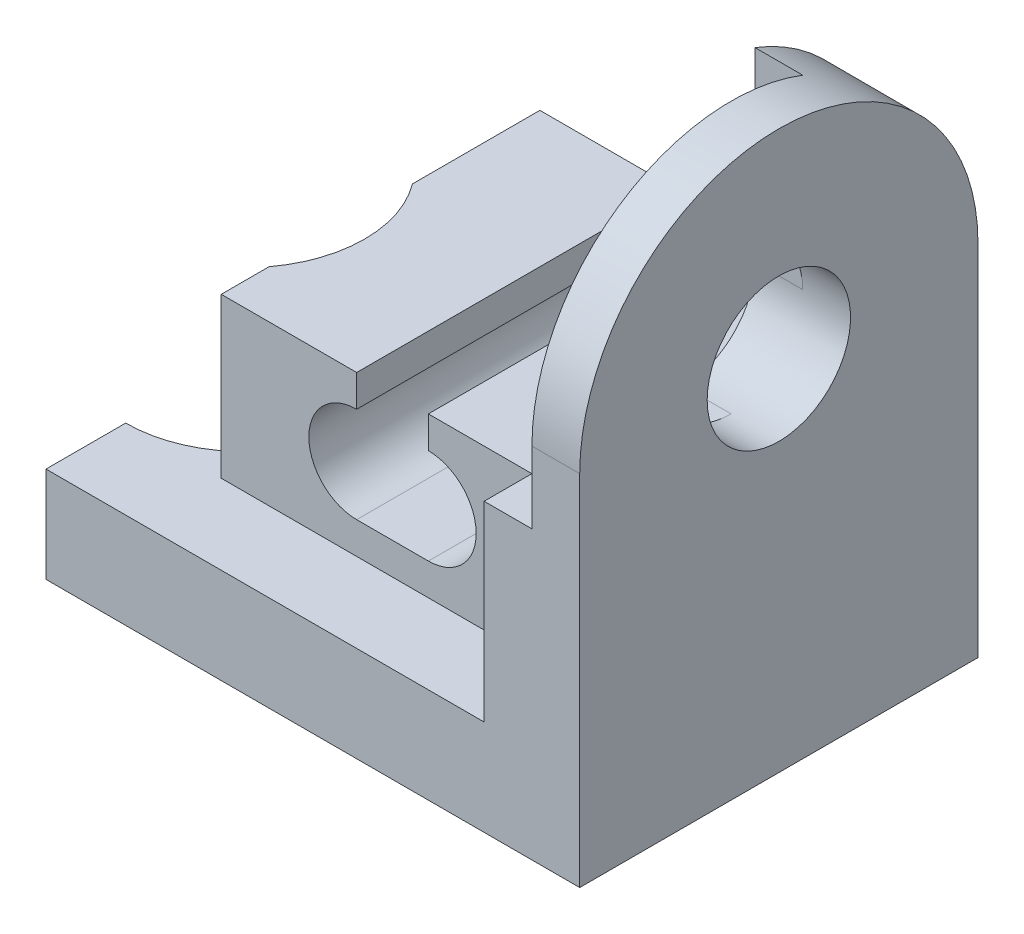
ISO-10303-21;
HEADER;
FILE_DESCRIPTION(('STEP AP214'),'2;1');
FILE_NAME('part.step','',(''),(''),'','','');
FILE_SCHEMA(('AUTOMOTIVE_DESIGN { 1 0 10303 214 1 1 1 1 }'));
ENDSEC;
DATA;
#1=APPLICATION_CONTEXT('core data for automotive mechanical design processes');
#2=APPLICATION_PROTOCOL_DEFINITION('international standard','automotive_design',2000,#1);
#3=PRODUCT_CONTEXT('',#1,'mechanical');
#4=PRODUCT('Part','Part','',(#3));
#5=PRODUCT_RELATED_PRODUCT_CATEGORY('part','',(#4));
#6=PRODUCT_DEFINITION_FORMATION('','',#4);
#7=PRODUCT_DEFINITION_CONTEXT('part definition',#1,'design');
#8=PRODUCT_DEFINITION('design','',#6,#7);
#9=PRODUCT_DEFINITION_SHAPE('','',#8);
#10=(LENGTH_UNIT() NAMED_UNIT(*) SI_UNIT(.MILLI.,.METRE.));
#11=(NAMED_UNIT(*) PLANE_ANGLE_UNIT() SI_UNIT($,.RADIAN.));
#12=(NAMED_UNIT(*) SI_UNIT($,.STERADIAN.) SOLID_ANGLE_UNIT());
#13=UNCERTAINTY_MEASURE_WITH_UNIT(LENGTH_MEASURE(1.E-05),#10,'distance_accuracy_value','');
#14=(GEOMETRIC_REPRESENTATION_CONTEXT(3) GLOBAL_UNCERTAINTY_ASSIGNED_CONTEXT((#13)) GLOBAL_UNIT_ASSIGNED_CONTEXT((#10,
#11,#12)) REPRESENTATION_CONTEXT('',''));
#15=CARTESIAN_POINT('',(0.,0.,0.));
#16=DIRECTION('',(0.,0.,1.));
#17=DIRECTION('',(1.,0.,0.));
#18=AXIS2_PLACEMENT_3D('',#15,#16,#17);
#19=CARTESIAN_POINT('',(-12.,0.,-25.));
#20=DIRECTION('',(1.,0.,0.));
#21=DIRECTION('',(0.,1.,0.));
#22=AXIS2_PLACEMENT_3D('',#19,#20,#21);
#23=PLANE('',#22);
#24=DIRECTION('',(0.,1.,0.));
#25=VECTOR('',#24,1.);
#26=CARTESIAN_POINT('',(-12.,0.,-9.));
#27=LINE('',#26,#25);
#28=CARTESIAN_POINT('',(-12.,45.,-9.));
#29=VERTEX_POINT('',#28);
#30=CARTESIAN_POINT('',(-12.,68.3238075793812,-9.));
#31=VERTEX_POINT('',#30);
#32=EDGE_CURVE('E224',#29,#31,#27,.T.);
#33=ORIENTED_EDGE('',*,*,#32,.T.);
#34=CARTESIAN_POINT('',(-12.,45.,0.));
#35=DIRECTION('',(-1.,0.,0.));
#36=DIRECTION('',(0.,0.,1.));
#37=AXIS2_PLACEMENT_3D('',#34,#35,#36);
#38=CIRCLE('',#37,25.);
#39=CARTESIAN_POINT('',(-12.,45.,-25.));
#40=VERTEX_POINT('',#39);
#41=EDGE_CURVE('E259',#31,#40,#38,.T.);
#42=ORIENTED_EDGE('',*,*,#41,.T.);
#43=DIRECTION('',(0.,1.,0.));
#44=VECTOR('',#43,1.);
#45=CARTESIAN_POINT('',(-12.,0.,-25.));
#46=LINE('',#45,#44);
#47=CARTESIAN_POINT('',(-12.,32.,-25.));
#48=VERTEX_POINT('',#47);
#49=EDGE_CURVE('E406',#48,#40,#46,.T.);
#50=ORIENTED_EDGE('',*,*,#49,.F.);
#51=DIRECTION('',(0.,0.,-1.));
#52=VECTOR('',#51,1.);
#53=CARTESIAN_POINT('',(-12.,32.,15.));
#54=LINE('',#53,#52);
#55=CARTESIAN_POINT('',(-12.,32.,15.));
#56=VERTEX_POINT('',#55);
#57=EDGE_CURVE('E366',#56,#48,#54,.T.);
#58=ORIENTED_EDGE('',*,*,#57,.F.);
#59=DIRECTION('',(0.,1.,0.));
#60=VECTOR('',#59,1.);
#61=CARTESIAN_POINT('',(-12.,0.,15.));
#62=LINE('',#61,#60);
#63=CARTESIAN_POINT('',(-12.,12.,15.));
#64=VERTEX_POINT('',#63);
#65=EDGE_CURVE('E336',#64,#56,#62,.T.);
#66=ORIENTED_EDGE('',*,*,#65,.F.);
#67=DIRECTION('',(0.,0.,1.));
#68=VECTOR('',#67,1.);
#69=CARTESIAN_POINT('',(-12.,12.,-25.));
#70=LINE('',#69,#68);
#71=CARTESIAN_POINT('',(-12.,12.,25.));
#72=VERTEX_POINT('',#71);
#73=EDGE_CURVE('E424',#64,#72,#70,.T.);
#74=ORIENTED_EDGE('',*,*,#73,.T.);
#75=DIRECTION('',(0.,1.,0.));
#76=VECTOR('',#75,1.);
#77=CARTESIAN_POINT('',(-12.,0.,25.));
#78=LINE('',#77,#76);
#79=CARTESIAN_POINT('',(-12.,36.,25.));
#80=VERTEX_POINT('',#79);
#81=EDGE_CURVE('E386',#72,#80,#78,.T.);
#82=ORIENTED_EDGE('',*,*,#81,.T.);
#83=DIRECTION('',(0.,0.,1.));
#84=VECTOR('',#83,1.);
#85=CARTESIAN_POINT('',(-12.,36.,0.));
#86=LINE('',#85,#84);
#87=CARTESIAN_POINT('',(-12.,36.,0.));
#88=VERTEX_POINT('',#87);
#89=EDGE_CURVE('E508',#88,#80,#86,.T.);
#90=ORIENTED_EDGE('',*,*,#89,.F.);
#91=CARTESIAN_POINT('',(-12.,45.,0.));
#92=DIRECTION('',(-1.,0.,0.));
#93=DIRECTION('',(0.,0.,1.));
#94=AXIS2_PLACEMENT_3D('',#91,#92,#93);
#95=CIRCLE('',#94,9.);
#96=EDGE_CURVE('E238',#29,#88,#95,.T.);
#97=ORIENTED_EDGE('',*,*,#96,.F.);
#98=EDGE_LOOP('',(#33,#42,#50,#58,#66,#74,#82,#90,#97));
#99=FACE_BOUND('',#98,.T.);
#100=ADVANCED_FACE('F59',(#99),#23,.F.);
#101=CARTESIAN_POINT('',(0.,45.,0.));
#102=DIRECTION('',(-1.,0.,0.));
#103=DIRECTION('',(0.,0.,1.));
#104=AXIS2_PLACEMENT_3D('',#101,#102,#103);
#105=CYLINDRICAL_SURFACE('',#104,25.);
#106=ORIENTED_EDGE('',*,*,#41,.F.);
#107=DIRECTION('',(-1.,0.,0.));
#108=VECTOR('',#107,1.);
#109=CARTESIAN_POINT('',(-6.00000000000001,68.3238075793812,-9.));
#110=LINE('',#109,#108);
#111=CARTESIAN_POINT('',(-6.00000000000001,68.3238075793812,-9.));
#112=VERTEX_POINT('',#111);
#113=EDGE_CURVE('E243',#112,#31,#110,.T.);
#114=ORIENTED_EDGE('',*,*,#113,.F.);
#115=CARTESIAN_POINT('',(-6.00000000000001,45.,0.));
#116=DIRECTION('',(-1.,0.,0.));
#117=DIRECTION('',(0.,0.,1.));
#118=AXIS2_PLACEMENT_3D('',#115,#116,#117);
#119=CIRCLE('',#118,25.);
#120=CARTESIAN_POINT('',(-6.00000000000001,45.,25.));
#121=VERTEX_POINT('',#120);
#122=EDGE_CURVE('E245',#121,#112,#119,.T.);
#123=ORIENTED_EDGE('',*,*,#122,.F.);
#124=DIRECTION('',(-1.,0.,0.));
#125=VECTOR('',#124,1.);
#126=CARTESIAN_POINT('',(0.,45.,25.));
#127=LINE('',#126,#125);
#128=CARTESIAN_POINT('',(0.,45.,25.));
#129=VERTEX_POINT('',#128);
#130=EDGE_CURVE('E253',#129,#121,#127,.T.);
#131=ORIENTED_EDGE('',*,*,#130,.F.);
#132=CARTESIAN_POINT('',(0.,45.,0.));
#133=DIRECTION('',(-1.,0.,0.));
#134=DIRECTION('',(0.,0.,1.));
#135=AXIS2_PLACEMENT_3D('',#132,#133,#134);
#136=CIRCLE('',#135,25.);
#137=CARTESIAN_POINT('',(0.,45.,-25.));
#138=VERTEX_POINT('',#137);
#139=EDGE_CURVE('E82',#129,#138,#136,.T.);
#140=ORIENTED_EDGE('',*,*,#139,.T.);
#141=DIRECTION('',(-1.,0.,0.));
#142=VECTOR('',#141,1.);
#143=CARTESIAN_POINT('',(0.,45.,-25.));
#144=LINE('',#143,#142);
#145=EDGE_CURVE('E262',#138,#40,#144,.T.);
#146=ORIENTED_EDGE('',*,*,#145,.T.);
#147=EDGE_LOOP('',(#106,#114,#123,#131,#140,#146));
#148=FACE_BOUND('',#147,.T.);
#149=ADVANCED_FACE('F517',(#148),#105,.T.);
#150=CARTESIAN_POINT('',(0.,45.,0.));
#151=DIRECTION('',(-1.,0.,0.));
#152=DIRECTION('',(0.,0.,1.));
#153=AXIS2_PLACEMENT_3D('',#150,#151,#152);
#154=CYLINDRICAL_SURFACE('',#153,9.);
#155=CARTESIAN_POINT('',(0.,45.,0.));
#156=DIRECTION('',(-1.,0.,0.));
#157=DIRECTION('',(0.,0.,1.));
#158=AXIS2_PLACEMENT_3D('',#155,#156,#157);
#159=CIRCLE('',#158,9.);
#160=CARTESIAN_POINT('',(0.,45.,9.));
#161=VERTEX_POINT('',#160);
#162=EDGE_CURVE('E249',#161,#161,#159,.T.);
#163=ORIENTED_EDGE('',*,*,#162,.F.);
#164=EDGE_LOOP('',(#163));
#165=FACE_BOUND('',#164,.T.);
#166=DIRECTION('',(-1.,0.,0.));
#167=VECTOR('',#166,1.);
#168=CARTESIAN_POINT('',(-6.00000000000001,45.,-9.));
#169=LINE('',#168,#167);
#170=CARTESIAN_POINT('',(-6.00000000000001,45.,-9.));
#171=VERTEX_POINT('',#170);
#172=EDGE_CURVE('E74',#171,#29,#169,.T.);
#173=ORIENTED_EDGE('',*,*,#172,.T.);
#174=ORIENTED_EDGE('',*,*,#96,.T.);
#175=DIRECTION('',(-1.,0.,0.));
#176=VECTOR('',#175,1.);
#177=CARTESIAN_POINT('',(-6.00000000000001,36.,0.));
#178=LINE('',#177,#176);
#179=CARTESIAN_POINT('',(-6.00000000000001,36.,0.));
#180=VERTEX_POINT('',#179);
#181=EDGE_CURVE('E228',#180,#88,#178,.T.);
#182=ORIENTED_EDGE('',*,*,#181,.F.);
#183=CARTESIAN_POINT('',(-6.00000000000001,45.,0.));
#184=DIRECTION('',(-1.,0.,0.));
#185=DIRECTION('',(0.,0.,1.));
#186=AXIS2_PLACEMENT_3D('',#183,#184,#185);
#187=CIRCLE('',#186,9.);
#188=EDGE_CURVE('E214',#180,#171,#187,.T.);
#189=ORIENTED_EDGE('',*,*,#188,.T.);
#190=EDGE_LOOP('',(#173,#174,#182,#189));
#191=FACE_BOUND('',#190,.T.);
#192=ADVANCED_FACE('F236',(#165,#191),#154,.F.);
#193=CARTESIAN_POINT('',(0.,0.,-25.));
#194=DIRECTION('',(1.,0.,0.));
#195=DIRECTION('',(0.,0.,-1.));
#196=AXIS2_PLACEMENT_3D('',#193,#194,#195);
#197=PLANE('',#196);
#198=ORIENTED_EDGE('',*,*,#162,.T.);
#199=EDGE_LOOP('',(#198));
#200=FACE_BOUND('',#199,.T.);
#201=ORIENTED_EDGE('',*,*,#139,.F.);
#202=DIRECTION('',(0.,1.,0.));
#203=VECTOR('',#202,1.);
#204=CARTESIAN_POINT('',(0.,0.,25.));
#205=LINE('',#204,#203);
#206=CARTESIAN_POINT('',(0.,0.,25.));
#207=VERTEX_POINT('',#206);
#208=EDGE_CURVE('E402',#207,#129,#205,.T.);
#209=ORIENTED_EDGE('',*,*,#208,.F.);
#210=DIRECTION('',(0.,0.,1.));
#211=VECTOR('',#210,1.);
#212=CARTESIAN_POINT('',(0.,0.,-25.));
#213=LINE('',#212,#211);
#214=CARTESIAN_POINT('',(0.,0.,-25.));
#215=VERTEX_POINT('',#214);
#216=EDGE_CURVE('E425',#215,#207,#213,.T.);
#217=ORIENTED_EDGE('',*,*,#216,.F.);
#218=DIRECTION('',(0.,1.,0.));
#219=VECTOR('',#218,1.);
#220=CARTESIAN_POINT('',(0.,0.,-25.));
#221=LINE('',#220,#219);
#222=EDGE_CURVE('E420',#215,#138,#221,.T.);
#223=ORIENTED_EDGE('',*,*,#222,.T.);
#224=EDGE_LOOP('',(#201,#209,#217,#223));
#225=FACE_BOUND('',#224,.T.);
#226=ADVANCED_FACE('F523',(#200,#225),#197,.T.);
#227=CARTESIAN_POINT('',(0.,0.,25.));
#228=DIRECTION('',(0.,0.,1.));
#229=DIRECTION('',(1.,0.,0.));
#230=AXIS2_PLACEMENT_3D('',#227,#228,#229);
#231=PLANE('',#230);
#232=DIRECTION('',(-1.,0.,0.));
#233=VECTOR('',#232,1.);
#234=CARTESIAN_POINT('',(-6.00000000000001,36.,25.));
#235=LINE('',#234,#233);
#236=CARTESIAN_POINT('',(-6.00000000000001,36.,25.));
#237=VERTEX_POINT('',#236);
#238=EDGE_CURVE('E231',#237,#80,#235,.T.);
#239=ORIENTED_EDGE('',*,*,#238,.T.);
#240=ORIENTED_EDGE('',*,*,#81,.F.);
#241=DIRECTION('',(-1.,0.,0.));
#242=VECTOR('',#241,1.);
#243=CARTESIAN_POINT('',(0.,12.,25.));
#244=LINE('',#243,#242);
#245=CARTESIAN_POINT('',(-67.,12.,25.));
#246=VERTEX_POINT('',#245);
#247=EDGE_CURVE('E390',#72,#246,#244,.T.);
#248=ORIENTED_EDGE('',*,*,#247,.T.);
#249=DIRECTION('',(0.,1.,0.));
#250=VECTOR('',#249,1.);
#251=CARTESIAN_POINT('',(-67.,0.,25.));
#252=LINE('',#251,#250);
#253=CARTESIAN_POINT('',(-67.,0.,25.));
#254=VERTEX_POINT('',#253);
#255=EDGE_CURVE('E394',#254,#246,#252,.T.);
#256=ORIENTED_EDGE('',*,*,#255,.F.);
#257=DIRECTION('',(-1.,0.,0.));
#258=VECTOR('',#257,1.);
#259=CARTESIAN_POINT('',(0.,0.,25.));
#260=LINE('',#259,#258);
#261=EDGE_CURVE('E398',#207,#254,#260,.T.);
#262=ORIENTED_EDGE('',*,*,#261,.F.);
#263=ORIENTED_EDGE('',*,*,#208,.T.);
#264=ORIENTED_EDGE('',*,*,#130,.T.);
#265=DIRECTION('',(0.,1.,0.));
#266=VECTOR('',#265,1.);
#267=CARTESIAN_POINT('',(-6.00000000000001,0.,25.));
#268=LINE('',#267,#266);
#269=EDGE_CURVE('E233',#237,#121,#268,.T.);
#270=ORIENTED_EDGE('',*,*,#269,.F.);
#271=EDGE_LOOP('',(#239,#240,#248,#256,#262,#263,#264,#270));
#272=FACE_BOUND('',#271,.T.);
#273=ADVANCED_FACE('F518',(#272),#231,.T.);
#274=CARTESIAN_POINT('',(0.,0.,-25.));
#275=DIRECTION('',(0.,0.,1.));
#276=DIRECTION('',(1.,0.,0.));
#277=AXIS2_PLACEMENT_3D('',#274,#275,#276);
#278=PLANE('',#277);
#279=ORIENTED_EDGE('',*,*,#145,.F.);
#280=ORIENTED_EDGE('',*,*,#222,.F.);
#281=DIRECTION('',(-1.,0.,0.));
#282=VECTOR('',#281,1.);
#283=CARTESIAN_POINT('',(0.,0.,-25.));
#284=LINE('',#283,#282);
#285=CARTESIAN_POINT('',(-67.,0.,-25.));
#286=VERTEX_POINT('',#285);
#287=EDGE_CURVE('E417',#215,#286,#284,.T.);
#288=ORIENTED_EDGE('',*,*,#287,.T.);
#289=DIRECTION('',(0.,1.,0.));
#290=VECTOR('',#289,1.);
#291=CARTESIAN_POINT('',(-67.,0.,-25.));
#292=LINE('',#291,#290);
#293=CARTESIAN_POINT('',(-67.,12.,-25.));
#294=VERTEX_POINT('',#293);
#295=EDGE_CURVE('E413',#286,#294,#292,.T.);
#296=ORIENTED_EDGE('',*,*,#295,.T.);
#297=DIRECTION('',(-1.,0.,0.));
#298=VECTOR('',#297,1.);
#299=CARTESIAN_POINT('',(0.,12.,-25.));
#300=LINE('',#299,#298);
#301=CARTESIAN_POINT('',(-55.,12.,-25.));
#302=VERTEX_POINT('',#301);
#303=EDGE_CURVE('E410',#302,#294,#300,.T.);
#304=ORIENTED_EDGE('',*,*,#303,.F.);
#305=DIRECTION('',(0.,1.,0.));
#306=VECTOR('',#305,1.);
#307=CARTESIAN_POINT('',(-55.,0.,-25.));
#308=LINE('',#307,#306);
#309=CARTESIAN_POINT('',(-55.,32.,-25.));
#310=VERTEX_POINT('',#309);
#311=EDGE_CURVE('E298',#302,#310,#308,.T.);
#312=ORIENTED_EDGE('',*,*,#311,.T.);
#313=DIRECTION('',(-1.,0.,0.));
#314=VECTOR('',#313,1.);
#315=CARTESIAN_POINT('',(0.,32.,-25.));
#316=LINE('',#315,#314);
#317=CARTESIAN_POINT('',(-38.,32.,-25.));
#318=VERTEX_POINT('',#317);
#319=EDGE_CURVE('E294',#318,#310,#316,.T.);
#320=ORIENTED_EDGE('',*,*,#319,.F.);
#321=DIRECTION('',(0.,1.,0.));
#322=VECTOR('',#321,1.);
#323=CARTESIAN_POINT('',(-38.,0.,-25.));
#324=LINE('',#323,#322);
#325=CARTESIAN_POINT('',(-38.,28.0000000262302,-25.));
#326=VERTEX_POINT('',#325);
#327=EDGE_CURVE('E290',#326,#318,#324,.T.);
#328=ORIENTED_EDGE('',*,*,#327,.F.);
#329=CARTESIAN_POINT('',(-38.,22.,-25.));
#330=DIRECTION('',(0.,0.,1.));
#331=DIRECTION('',(1.,0.,0.));
#332=AXIS2_PLACEMENT_3D('',#329,#330,#331);
#333=CIRCLE('',#332,6.00000002623018);
#334=CARTESIAN_POINT('',(-37.9992065743153,16.0000000262302,-25.));
#335=VERTEX_POINT('',#334);
#336=EDGE_CURVE('E286',#326,#335,#333,.T.);
#337=ORIENTED_EDGE('',*,*,#336,.T.);
#338=DIRECTION('',(1.,0.,0.));
#339=VECTOR('',#338,1.);
#340=CARTESIAN_POINT('',(0.,16.0000000262302,-25.));
#341=LINE('',#340,#339);
#342=CARTESIAN_POINT('',(-29.,16.0000000262302,-25.));
#343=VERTEX_POINT('',#342);
#344=EDGE_CURVE('E314',#335,#343,#341,.T.);
#345=ORIENTED_EDGE('',*,*,#344,.T.);
#346=CARTESIAN_POINT('',(-29.,22.0000000262302,-25.));
#347=DIRECTION('',(0.,0.,1.));
#348=DIRECTION('',(1.,0.,0.));
#349=AXIS2_PLACEMENT_3D('',#346,#347,#348);
#350=CIRCLE('',#349,6.);
#351=CARTESIAN_POINT('',(-29.,28.0000000262302,-25.));
#352=VERTEX_POINT('',#351);
#353=EDGE_CURVE('E310',#343,#352,#350,.T.);
#354=ORIENTED_EDGE('',*,*,#353,.T.);
#355=DIRECTION('',(0.,1.,0.));
#356=VECTOR('',#355,1.);
#357=CARTESIAN_POINT('',(-29.,0.,-25.));
#358=LINE('',#357,#356);
#359=CARTESIAN_POINT('',(-29.,32.,-25.));
#360=VERTEX_POINT('',#359);
#361=EDGE_CURVE('E306',#352,#360,#358,.T.);
#362=ORIENTED_EDGE('',*,*,#361,.T.);
#363=DIRECTION('',(-1.,0.,0.));
#364=VECTOR('',#363,1.);
#365=CARTESIAN_POINT('',(0.,32.,-25.));
#366=LINE('',#365,#364);
#367=EDGE_CURVE('E302',#48,#360,#366,.T.);
#368=ORIENTED_EDGE('',*,*,#367,.F.);
#369=ORIENTED_EDGE('',*,*,#49,.T.);
#370=EDGE_LOOP('',(#279,#280,#288,#296,#304,#312,#320,#328,#337,#345,#354,#362,#368,#369));
#371=FACE_BOUND('',#370,.T.);
#372=ADVANCED_FACE('F483',(#371),#278,.F.);
#373=CARTESIAN_POINT('',(-67.,0.,-25.));
#374=DIRECTION('',(1.,0.,0.));
#375=DIRECTION('',(0.,0.,-1.));
#376=AXIS2_PLACEMENT_3D('',#373,#374,#375);
#377=PLANE('',#376);
#378=DIRECTION('',(0.,0.,1.));
#379=VECTOR('',#378,1.);
#380=CARTESIAN_POINT('',(-67.,12.,-25.));
#381=LINE('',#380,#379);
#382=CARTESIAN_POINT('',(-67.,12.,15.));
#383=VERTEX_POINT('',#382);
#384=EDGE_CURVE('E437',#383,#246,#381,.T.);
#385=ORIENTED_EDGE('',*,*,#384,.F.);
#386=DIRECTION('',(0.,-1.,0.));
#387=VECTOR('',#386,1.);
#388=CARTESIAN_POINT('',(-67.,70.,15.));
#389=LINE('',#388,#387);
#390=CARTESIAN_POINT('',(-67.,0.,15.));
#391=VERTEX_POINT('',#390);
#392=EDGE_CURVE('E277',#383,#391,#389,.T.);
#393=ORIENTED_EDGE('',*,*,#392,.T.);
#394=DIRECTION('',(0.,0.,1.));
#395=VECTOR('',#394,1.);
#396=CARTESIAN_POINT('',(-67.,0.,-25.));
#397=LINE('',#396,#395);
#398=EDGE_CURVE('E432',#391,#254,#397,.T.);
#399=ORIENTED_EDGE('',*,*,#398,.T.);
#400=ORIENTED_EDGE('',*,*,#255,.T.);
#401=EDGE_LOOP('',(#385,#393,#399,#400));
#402=FACE_BOUND('',#401,.T.);
#403=ADVANCED_FACE('F572',(#402),#377,.F.);
#404=CARTESIAN_POINT('',(0.,12.,-25.));
#405=DIRECTION('',(0.,1.,0.));
#406=DIRECTION('',(-1.,0.,0.));
#407=AXIS2_PLACEMENT_3D('',#404,#405,#406);
#408=PLANE('',#407);
#409=CARTESIAN_POINT('',(-67.,12.,0.));
#410=DIRECTION('',(0.,1.,0.));
#411=DIRECTION('',(-1.,0.,0.));
#412=AXIS2_PLACEMENT_3D('',#409,#410,#411);
#413=CIRCLE('',#412,15.);
#414=CARTESIAN_POINT('',(-55.,12.,8.99999999999995));
#415=VERTEX_POINT('',#414);
#416=EDGE_CURVE('E274',#383,#415,#413,.T.);
#417=ORIENTED_EDGE('',*,*,#416,.F.);
#418=ORIENTED_EDGE('',*,*,#384,.T.);
#419=ORIENTED_EDGE('',*,*,#247,.F.);
#420=ORIENTED_EDGE('',*,*,#73,.F.);
#421=DIRECTION('',(-1.,0.,0.));
#422=VECTOR('',#421,1.);
#423=CARTESIAN_POINT('',(0.,12.,15.));
#424=LINE('',#423,#422);
#425=CARTESIAN_POINT('',(-55.,12.,15.));
#426=VERTEX_POINT('',#425);
#427=EDGE_CURVE('E332',#64,#426,#424,.T.);
#428=ORIENTED_EDGE('',*,*,#427,.T.);
#429=DIRECTION('',(0.,0.,-1.));
#430=VECTOR('',#429,1.);
#431=CARTESIAN_POINT('',(-55.,12.,15.));
#432=LINE('',#431,#430);
#433=EDGE_CURVE('E371',#426,#415,#432,.T.);
#434=ORIENTED_EDGE('',*,*,#433,.T.);
#435=EDGE_LOOP('',(#417,#418,#419,#420,#428,#434));
#436=FACE_BOUND('',#435,.T.);
#437=ADVANCED_FACE('F459',(#436),#408,.T.);
#438=CARTESIAN_POINT('',(-55.,0.,15.));
#439=DIRECTION('',(-1.,0.,0.));
#440=DIRECTION('',(0.,-1.,0.));
#441=AXIS2_PLACEMENT_3D('',#438,#439,#440);
#442=PLANE('',#441);
#443=DIRECTION('',(0.,-1.,0.));
#444=VECTOR('',#443,1.);
#445=CARTESIAN_POINT('',(-55.,70.,-8.99999999999995));
#446=LINE('',#445,#444);
#447=CARTESIAN_POINT('',(-55.,32.,-8.99999999999996));
#448=VERTEX_POINT('',#447);
#449=CARTESIAN_POINT('',(-55.,12.,-8.99999999999995));
#450=VERTEX_POINT('',#449);
#451=EDGE_CURVE('E13',#448,#450,#446,.T.);
#452=ORIENTED_EDGE('',*,*,#451,.F.);
#453=DIRECTION('',(0.,0.,-1.));
#454=VECTOR('',#453,1.);
#455=CARTESIAN_POINT('',(-55.,32.,15.));
#456=LINE('',#455,#454);
#457=EDGE_CURVE('E375',#448,#310,#456,.T.);
#458=ORIENTED_EDGE('',*,*,#457,.T.);
#459=ORIENTED_EDGE('',*,*,#311,.F.);
#460=EDGE_CURVE('E370',#450,#302,#432,.T.);
#461=ORIENTED_EDGE('',*,*,#460,.F.);
#462=EDGE_LOOP('',(#452,#458,#459,#461));
#463=FACE_BOUND('',#462,.T.);
#464=ADVANCED_FACE('F497',(#463),#442,.T.);
#465=CARTESIAN_POINT('',(0.,0.,-25.));
#466=DIRECTION('',(0.,1.,0.));
#467=DIRECTION('',(-1.,0.,0.));
#468=AXIS2_PLACEMENT_3D('',#465,#466,#467);
#469=PLANE('',#468);
#470=ORIENTED_EDGE('',*,*,#398,.F.);
#471=CARTESIAN_POINT('',(-67.,0.,0.));
#472=DIRECTION('',(0.,-1.,0.));
#473=DIRECTION('',(1.,0.,0.));
#474=AXIS2_PLACEMENT_3D('',#471,#472,#473);
#475=CIRCLE('',#474,15.);
#476=CARTESIAN_POINT('',(-67.,0.,-15.));
#477=VERTEX_POINT('',#476);
#478=EDGE_CURVE('E267',#477,#391,#475,.T.);
#479=ORIENTED_EDGE('',*,*,#478,.F.);
#480=EDGE_CURVE('E428',#286,#477,#397,.T.);
#481=ORIENTED_EDGE('',*,*,#480,.F.);
#482=ORIENTED_EDGE('',*,*,#287,.F.);
#483=ORIENTED_EDGE('',*,*,#216,.T.);
#484=ORIENTED_EDGE('',*,*,#261,.T.);
#485=EDGE_LOOP('',(#470,#479,#481,#482,#483,#484));
#486=FACE_BOUND('',#485,.T.);
#487=ADVANCED_FACE('F575',(#486),#469,.F.);
#488=ORIENTED_EDGE('',*,*,#480,.T.);
#489=DIRECTION('',(0.,-1.,0.));
#490=VECTOR('',#489,1.);
#491=CARTESIAN_POINT('',(-67.,70.,-15.));
#492=LINE('',#491,#490);
#493=CARTESIAN_POINT('',(-67.,12.,-15.));
#494=VERTEX_POINT('',#493);
#495=EDGE_CURVE('E282',#477,#494,#492,.F.);
#496=ORIENTED_EDGE('',*,*,#495,.T.);
#497=EDGE_CURVE('E433',#294,#494,#381,.T.);
#498=ORIENTED_EDGE('',*,*,#497,.F.);
#499=ORIENTED_EDGE('',*,*,#295,.F.);
#500=EDGE_LOOP('',(#488,#496,#498,#499));
#501=FACE_BOUND('',#500,.T.);
#502=ADVANCED_FACE('F578',(#501),#377,.F.);
#503=EDGE_CURVE('E278',#450,#494,#413,.T.);
#504=ORIENTED_EDGE('',*,*,#503,.F.);
#505=ORIENTED_EDGE('',*,*,#460,.T.);
#506=ORIENTED_EDGE('',*,*,#303,.T.);
#507=ORIENTED_EDGE('',*,*,#497,.T.);
#508=EDGE_LOOP('',(#504,#505,#506,#507));
#509=FACE_BOUND('',#508,.T.);
#510=ADVANCED_FACE('F568',(#509),#408,.T.);
#511=CARTESIAN_POINT('',(-38.,22.,15.));
#512=DIRECTION('',(0.,0.,-1.));
#513=DIRECTION('',(-1.,0.,0.));
#514=AXIS2_PLACEMENT_3D('',#511,#512,#513);
#515=CYLINDRICAL_SURFACE('',#514,6.00000002623018);
#516=DIRECTION('',(0.,0.,-1.));
#517=VECTOR('',#516,1.);
#518=CARTESIAN_POINT('',(-37.9992065743153,16.0000000262302,15.));
#519=LINE('',#518,#517);
#520=CARTESIAN_POINT('',(-37.9992065743153,16.0000000262302,15.));
#521=VERTEX_POINT('',#520);
#522=EDGE_CURVE('E354',#521,#335,#519,.T.);
#523=ORIENTED_EDGE('',*,*,#522,.T.);
#524=ORIENTED_EDGE('',*,*,#336,.F.);
#525=DIRECTION('',(0.,0.,-1.));
#526=VECTOR('',#525,1.);
#527=CARTESIAN_POINT('',(-38.,28.0000000262302,15.));
#528=LINE('',#527,#526);
#529=CARTESIAN_POINT('',(-38.,28.0000000262302,15.));
#530=VERTEX_POINT('',#529);
#531=EDGE_CURVE('E383',#530,#326,#528,.T.);
#532=ORIENTED_EDGE('',*,*,#531,.F.);
#533=CARTESIAN_POINT('',(-38.,22.,15.));
#534=DIRECTION('',(0.,0.,1.));
#535=DIRECTION('',(1.,0.,0.));
#536=AXIS2_PLACEMENT_3D('',#533,#534,#535);
#537=CIRCLE('',#536,6.00000002623018);
#538=EDGE_CURVE('E318',#530,#521,#537,.T.);
#539=ORIENTED_EDGE('',*,*,#538,.T.);
#540=EDGE_LOOP('',(#523,#524,#532,#539));
#541=FACE_BOUND('',#540,.T.);
#542=ADVANCED_FACE('F488',(#541),#515,.F.);
#543=CARTESIAN_POINT('',(-38.,0.,15.));
#544=DIRECTION('',(-1.,0.,0.));
#545=DIRECTION('',(0.,0.,1.));
#546=AXIS2_PLACEMENT_3D('',#543,#544,#545);
#547=PLANE('',#546);
#548=ORIENTED_EDGE('',*,*,#531,.T.);
#549=ORIENTED_EDGE('',*,*,#327,.T.);
#550=DIRECTION('',(0.,0.,-1.));
#551=VECTOR('',#550,1.);
#552=CARTESIAN_POINT('',(-38.,32.,15.));
#553=LINE('',#552,#551);
#554=CARTESIAN_POINT('',(-38.,32.,15.));
#555=VERTEX_POINT('',#554);
#556=EDGE_CURVE('E380',#555,#318,#553,.T.);
#557=ORIENTED_EDGE('',*,*,#556,.F.);
#558=DIRECTION('',(0.,1.,0.));
#559=VECTOR('',#558,1.);
#560=CARTESIAN_POINT('',(-38.,0.,15.));
#561=LINE('',#560,#559);
#562=EDGE_CURVE('E322',#530,#555,#561,.T.);
#563=ORIENTED_EDGE('',*,*,#562,.F.);
#564=EDGE_LOOP('',(#548,#549,#557,#563));
#565=FACE_BOUND('',#564,.T.);
#566=ADVANCED_FACE('F492',(#565),#547,.F.);
#567=CARTESIAN_POINT('',(0.,32.,15.));
#568=DIRECTION('',(0.,-1.,0.));
#569=DIRECTION('',(1.,0.,0.));
#570=AXIS2_PLACEMENT_3D('',#567,#568,#569);
#571=PLANE('',#570);
#572=ORIENTED_EDGE('',*,*,#457,.F.);
#573=CARTESIAN_POINT('',(-67.,32.,0.));
#574=DIRECTION('',(0.,-1.,0.));
#575=DIRECTION('',(1.,0.,0.));
#576=AXIS2_PLACEMENT_3D('',#573,#574,#575);
#577=CIRCLE('',#576,15.);
#578=CARTESIAN_POINT('',(-55.,32.,8.99999999999995));
#579=VERTEX_POINT('',#578);
#580=EDGE_CURVE('E270',#448,#579,#577,.T.);
#581=ORIENTED_EDGE('',*,*,#580,.T.);
#582=CARTESIAN_POINT('',(-55.,32.,15.));
#583=VERTEX_POINT('',#582);
#584=EDGE_CURVE('E376',#583,#579,#456,.T.);
#585=ORIENTED_EDGE('',*,*,#584,.F.);
#586=DIRECTION('',(-1.,0.,0.));
#587=VECTOR('',#586,1.);
#588=CARTESIAN_POINT('',(0.,32.,15.));
#589=LINE('',#588,#587);
#590=EDGE_CURVE('E325',#555,#583,#589,.T.);
#591=ORIENTED_EDGE('',*,*,#590,.F.);
#592=ORIENTED_EDGE('',*,*,#556,.T.);
#593=ORIENTED_EDGE('',*,*,#319,.T.);
#594=EDGE_LOOP('',(#572,#581,#585,#591,#592,#593));
#595=FACE_BOUND('',#594,.T.);
#596=ADVANCED_FACE('F449',(#595),#571,.F.);
#597=DIRECTION('',(0.,-1.,0.));
#598=VECTOR('',#597,1.);
#599=CARTESIAN_POINT('',(-55.,70.,8.99999999999995));
#600=LINE('',#599,#598);
#601=EDGE_CURVE('E67',#415,#579,#600,.F.);
#602=ORIENTED_EDGE('',*,*,#601,.F.);
#603=ORIENTED_EDGE('',*,*,#433,.F.);
#604=DIRECTION('',(0.,1.,0.));
#605=VECTOR('',#604,1.);
#606=CARTESIAN_POINT('',(-55.,0.,15.));
#607=LINE('',#606,#605);
#608=EDGE_CURVE('E328',#426,#583,#607,.T.);
#609=ORIENTED_EDGE('',*,*,#608,.T.);
#610=ORIENTED_EDGE('',*,*,#584,.T.);
#611=EDGE_LOOP('',(#602,#603,#609,#610));
#612=FACE_BOUND('',#611,.T.);
#613=ADVANCED_FACE('F451',(#612),#442,.T.);
#614=CARTESIAN_POINT('',(0.,32.,15.));
#615=DIRECTION('',(0.,-1.,0.));
#616=DIRECTION('',(1.,0.,0.));
#617=AXIS2_PLACEMENT_3D('',#614,#615,#616);
#618=PLANE('',#617);
#619=ORIENTED_EDGE('',*,*,#57,.T.);
#620=ORIENTED_EDGE('',*,*,#367,.T.);
#621=DIRECTION('',(0.,0.,-1.));
#622=VECTOR('',#621,1.);
#623=CARTESIAN_POINT('',(-29.,32.,15.));
#624=LINE('',#623,#622);
#625=CARTESIAN_POINT('',(-29.,32.,15.));
#626=VERTEX_POINT('',#625);
#627=EDGE_CURVE('E363',#626,#360,#624,.T.);
#628=ORIENTED_EDGE('',*,*,#627,.F.);
#629=DIRECTION('',(-1.,0.,0.));
#630=VECTOR('',#629,1.);
#631=CARTESIAN_POINT('',(0.,32.,15.));
#632=LINE('',#631,#630);
#633=EDGE_CURVE('E339',#56,#626,#632,.T.);
#634=ORIENTED_EDGE('',*,*,#633,.F.);
#635=EDGE_LOOP('',(#619,#620,#628,#634));
#636=FACE_BOUND('',#635,.T.);
#637=ADVANCED_FACE('F470',(#636),#618,.F.);
#638=CARTESIAN_POINT('',(-29.,0.,15.));
#639=DIRECTION('',(-1.,0.,0.));
#640=DIRECTION('',(0.,0.,1.));
#641=AXIS2_PLACEMENT_3D('',#638,#639,#640);
#642=PLANE('',#641);
#643=ORIENTED_EDGE('',*,*,#627,.T.);
#644=ORIENTED_EDGE('',*,*,#361,.F.);
#645=DIRECTION('',(0.,0.,-1.));
#646=VECTOR('',#645,1.);
#647=CARTESIAN_POINT('',(-29.,28.0000000262302,15.));
#648=LINE('',#647,#646);
#649=CARTESIAN_POINT('',(-29.,28.0000000262302,15.));
#650=VERTEX_POINT('',#649);
#651=EDGE_CURVE('E360',#650,#352,#648,.T.);
#652=ORIENTED_EDGE('',*,*,#651,.F.);
#653=DIRECTION('',(0.,1.,0.));
#654=VECTOR('',#653,1.);
#655=CARTESIAN_POINT('',(-29.,0.,15.));
#656=LINE('',#655,#654);
#657=EDGE_CURVE('E342',#650,#626,#656,.T.);
#658=ORIENTED_EDGE('',*,*,#657,.T.);
#659=EDGE_LOOP('',(#643,#644,#652,#658));
#660=FACE_BOUND('',#659,.T.);
#661=ADVANCED_FACE('F473',(#660),#642,.T.);
#662=CARTESIAN_POINT('',(-29.,22.0000000262302,15.));
#663=DIRECTION('',(0.,0.,-1.));
#664=DIRECTION('',(-1.,0.,0.));
#665=AXIS2_PLACEMENT_3D('',#662,#663,#664);
#666=CYLINDRICAL_SURFACE('',#665,6.);
#667=ORIENTED_EDGE('',*,*,#651,.T.);
#668=ORIENTED_EDGE('',*,*,#353,.F.);
#669=DIRECTION('',(0.,0.,-1.));
#670=VECTOR('',#669,1.);
#671=CARTESIAN_POINT('',(-29.,16.0000000262302,15.));
#672=LINE('',#671,#670);
#673=CARTESIAN_POINT('',(-29.,16.0000000262302,15.));
#674=VERTEX_POINT('',#673);
#675=EDGE_CURVE('E357',#674,#343,#672,.T.);
#676=ORIENTED_EDGE('',*,*,#675,.F.);
#677=CARTESIAN_POINT('',(-29.,22.0000000262302,15.));
#678=DIRECTION('',(0.,0.,1.));
#679=DIRECTION('',(1.,0.,0.));
#680=AXIS2_PLACEMENT_3D('',#677,#678,#679);
#681=CIRCLE('',#680,6.);
#682=EDGE_CURVE('E346',#674,#650,#681,.T.);
#683=ORIENTED_EDGE('',*,*,#682,.T.);
#684=EDGE_LOOP('',(#667,#668,#676,#683));
#685=FACE_BOUND('',#684,.T.);
#686=ADVANCED_FACE('F477',(#685),#666,.F.);
#687=CARTESIAN_POINT('',(0.,16.0000000262302,15.));
#688=DIRECTION('',(0.,1.,0.));
#689=DIRECTION('',(0.,0.,1.));
#690=AXIS2_PLACEMENT_3D('',#687,#688,#689);
#691=PLANE('',#690);
#692=ORIENTED_EDGE('',*,*,#675,.T.);
#693=ORIENTED_EDGE('',*,*,#344,.F.);
#694=ORIENTED_EDGE('',*,*,#522,.F.);
#695=DIRECTION('',(1.,0.,0.));
#696=VECTOR('',#695,1.);
#697=CARTESIAN_POINT('',(0.,16.0000000262302,15.));
#698=LINE('',#697,#696);
#699=EDGE_CURVE('E350',#521,#674,#698,.T.);
#700=ORIENTED_EDGE('',*,*,#699,.T.);
#701=EDGE_LOOP('',(#692,#693,#694,#700));
#702=FACE_BOUND('',#701,.T.);
#703=ADVANCED_FACE('F481',(#702),#691,.T.);
#704=CARTESIAN_POINT('',(0.,0.,15.));
#705=DIRECTION('',(0.,0.,1.));
#706=DIRECTION('',(1.,0.,0.));
#707=AXIS2_PLACEMENT_3D('',#704,#705,#706);
#708=PLANE('',#707);
#709=ORIENTED_EDGE('',*,*,#538,.F.);
#710=ORIENTED_EDGE('',*,*,#562,.T.);
#711=ORIENTED_EDGE('',*,*,#590,.T.);
#712=ORIENTED_EDGE('',*,*,#608,.F.);
#713=ORIENTED_EDGE('',*,*,#427,.F.);
#714=ORIENTED_EDGE('',*,*,#65,.T.);
#715=ORIENTED_EDGE('',*,*,#633,.T.);
#716=ORIENTED_EDGE('',*,*,#657,.F.);
#717=ORIENTED_EDGE('',*,*,#682,.F.);
#718=ORIENTED_EDGE('',*,*,#699,.F.);
#719=EDGE_LOOP('',(#709,#710,#711,#712,#713,#714,#715,#716,#717,#718));
#720=FACE_BOUND('',#719,.T.);
#721=ADVANCED_FACE('F455',(#720),#708,.T.);
#722=CARTESIAN_POINT('',(-67.,70.,0.));
#723=DIRECTION('',(0.,-1.,0.));
#724=DIRECTION('',(1.,0.,0.));
#725=AXIS2_PLACEMENT_3D('',#722,#723,#724);
#726=CYLINDRICAL_SURFACE('',#725,15.);
#727=ORIENTED_EDGE('',*,*,#478,.T.);
#728=ORIENTED_EDGE('',*,*,#392,.F.);
#729=ORIENTED_EDGE('',*,*,#416,.T.);
#730=ORIENTED_EDGE('',*,*,#601,.T.);
#731=ORIENTED_EDGE('',*,*,#580,.F.);
#732=ORIENTED_EDGE('',*,*,#451,.T.);
#733=ORIENTED_EDGE('',*,*,#503,.T.);
#734=ORIENTED_EDGE('',*,*,#495,.F.);
#735=EDGE_LOOP('',(#727,#728,#729,#730,#731,#732,#733,#734));
#736=FACE_BOUND('',#735,.T.);
#737=ADVANCED_FACE('F442',(#736),#726,.F.);
#738=CARTESIAN_POINT('',(-6.00000000000001,0.,-9.));
#739=DIRECTION('',(0.,0.,1.));
#740=DIRECTION('',(1.,0.,0.));
#741=AXIS2_PLACEMENT_3D('',#738,#739,#740);
#742=PLANE('',#741);
#743=ORIENTED_EDGE('',*,*,#32,.F.);
#744=ORIENTED_EDGE('',*,*,#172,.F.);
#745=DIRECTION('',(0.,1.,0.));
#746=VECTOR('',#745,1.);
#747=CARTESIAN_POINT('',(-6.00000000000001,0.,-9.));
#748=LINE('',#747,#746);
#749=EDGE_CURVE('E220',#171,#112,#748,.T.);
#750=ORIENTED_EDGE('',*,*,#749,.T.);
#751=ORIENTED_EDGE('',*,*,#113,.T.);
#752=EDGE_LOOP('',(#743,#744,#750,#751));
#753=FACE_BOUND('',#752,.T.);
#754=ADVANCED_FACE('F527',(#753),#742,.T.);
#755=CARTESIAN_POINT('',(-6.00000000000001,36.,0.));
#756=DIRECTION('',(0.,-1.,0.));
#757=DIRECTION('',(0.,0.,-1.));
#758=AXIS2_PLACEMENT_3D('',#755,#756,#757);
#759=PLANE('',#758);
#760=ORIENTED_EDGE('',*,*,#89,.T.);
#761=ORIENTED_EDGE('',*,*,#238,.F.);
#762=DIRECTION('',(0.,0.,1.));
#763=VECTOR('',#762,1.);
#764=CARTESIAN_POINT('',(-6.00000000000001,36.,0.));
#765=LINE('',#764,#763);
#766=EDGE_CURVE('E217',#180,#237,#765,.T.);
#767=ORIENTED_EDGE('',*,*,#766,.F.);
#768=ORIENTED_EDGE('',*,*,#181,.T.);
#769=EDGE_LOOP('',(#760,#761,#767,#768));
#770=FACE_BOUND('',#769,.T.);
#771=ADVANCED_FACE('F227',(#770),#759,.F.);
#772=CARTESIAN_POINT('',(-6.00000000000001,0.,0.));
#773=DIRECTION('',(-1.,0.,0.));
#774=DIRECTION('',(0.,0.,1.));
#775=AXIS2_PLACEMENT_3D('',#772,#773,#774);
#776=PLANE('',#775);
#777=ORIENTED_EDGE('',*,*,#188,.F.);
#778=ORIENTED_EDGE('',*,*,#766,.T.);
#779=ORIENTED_EDGE('',*,*,#269,.T.);
#780=ORIENTED_EDGE('',*,*,#122,.T.);
#781=ORIENTED_EDGE('',*,*,#749,.F.);
#782=EDGE_LOOP('',(#777,#778,#779,#780,#781));
#783=FACE_BOUND('',#782,.T.);
#784=ADVANCED_FACE('F216',(#783),#776,.T.);
#785=CLOSED_SHELL('',(#100,#149,#192,#226,#273,#372,#403,#437,#464,#487,#502,#510,#542,#566,
#596,#613,#637,#661,#686,#703,#721,#737,#754,#771,#784));
#786=MANIFOLD_SOLID_BREP('B2',#785);
#787=ADVANCED_BREP_SHAPE_REPRESENTATION('',(#18,#786),#14);
#788=SHAPE_DEFINITION_REPRESENTATION(#9,#787);
ENDSEC;
END-ISO-10303-21;
